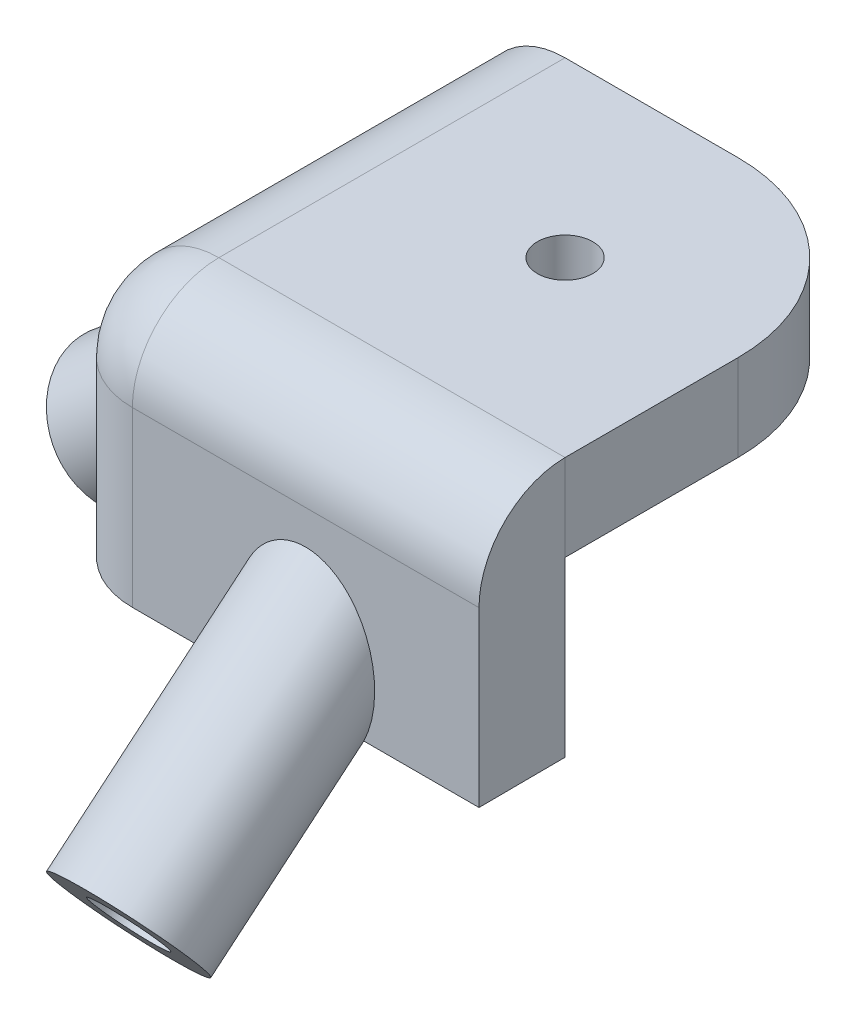
ISO-10303-21;
HEADER;
FILE_DESCRIPTION(('STEP AP214'),'2;1');
FILE_NAME('part.step','',(''),(''),'','','');
FILE_SCHEMA(('AUTOMOTIVE_DESIGN { 1 0 10303 214 1 1 1 1 }'));
ENDSEC;
DATA;
#1=APPLICATION_CONTEXT('core data for automotive mechanical design processes');
#2=APPLICATION_PROTOCOL_DEFINITION('international standard','automotive_design',2000,#1);
#3=PRODUCT_CONTEXT('',#1,'mechanical');
#4=PRODUCT('Part','Part','',(#3));
#5=PRODUCT_RELATED_PRODUCT_CATEGORY('part','',(#4));
#6=PRODUCT_DEFINITION_FORMATION('','',#4);
#7=PRODUCT_DEFINITION_CONTEXT('part definition',#1,'design');
#8=PRODUCT_DEFINITION('design','',#6,#7);
#9=PRODUCT_DEFINITION_SHAPE('','',#8);
#10=(LENGTH_UNIT() NAMED_UNIT(*) SI_UNIT(.MILLI.,.METRE.));
#11=(NAMED_UNIT(*) PLANE_ANGLE_UNIT() SI_UNIT($,.RADIAN.));
#12=(NAMED_UNIT(*) SI_UNIT($,.STERADIAN.) SOLID_ANGLE_UNIT());
#13=UNCERTAINTY_MEASURE_WITH_UNIT(LENGTH_MEASURE(1.E-05),#10,'distance_accuracy_value','');
#14=(GEOMETRIC_REPRESENTATION_CONTEXT(3) GLOBAL_UNCERTAINTY_ASSIGNED_CONTEXT((#13)) GLOBAL_UNIT_ASSIGNED_CONTEXT((#10,
#11,#12)) REPRESENTATION_CONTEXT('',''));
#15=CARTESIAN_POINT('',(0.,0.,0.));
#16=DIRECTION('',(0.,0.,1.));
#17=DIRECTION('',(1.,0.,0.));
#18=AXIS2_PLACEMENT_3D('',#15,#16,#17);
#19=CARTESIAN_POINT('',(10.,8.,10.));
#20=DIRECTION('',(-1.,0.,0.));
#21=DIRECTION('',(0.,0.,1.));
#22=AXIS2_PLACEMENT_3D('',#19,#20,#21);
#23=PLANE('',#22);
#24=DIRECTION('',(0.,0.,1.));
#25=VECTOR('',#24,1.);
#26=CARTESIAN_POINT('',(10.,3.,0.));
#27=LINE('',#26,#25);
#28=CARTESIAN_POINT('',(10.,3.,0.));
#29=VERTEX_POINT('',#28);
#30=CARTESIAN_POINT('',(10.,3.,10.));
#31=VERTEX_POINT('',#30);
#32=EDGE_CURVE('E134',#29,#31,#27,.T.);
#33=ORIENTED_EDGE('',*,*,#32,.F.);
#34=DIRECTION('',(0.,1.,0.));
#35=VECTOR('',#34,1.);
#36=CARTESIAN_POINT('',(10.,-15.8284607253071,0.));
#37=LINE('',#36,#35);
#38=CARTESIAN_POINT('',(10.,8.,0.));
#39=VERTEX_POINT('',#38);
#40=EDGE_CURVE('E147',#29,#39,#37,.T.);
#41=ORIENTED_EDGE('',*,*,#40,.T.);
#42=DIRECTION('',(0.,0.,-1.));
#43=VECTOR('',#42,1.);
#44=CARTESIAN_POINT('',(10.,8.,10.));
#45=LINE('',#44,#43);
#46=CARTESIAN_POINT('',(10.,8.,10.));
#47=VERTEX_POINT('',#46);
#48=EDGE_CURVE('E172',#47,#39,#45,.T.);
#49=ORIENTED_EDGE('',*,*,#48,.F.);
#50=DIRECTION('',(0.,-1.,0.));
#51=VECTOR('',#50,1.);
#52=CARTESIAN_POINT('',(10.,8.,10.));
#53=LINE('',#52,#51);
#54=EDGE_CURVE('E150',#47,#31,#53,.T.);
#55=ORIENTED_EDGE('',*,*,#54,.T.);
#56=EDGE_LOOP('',(#33,#41,#49,#55));
#57=FACE_BOUND('',#56,.T.);
#58=ADVANCED_FACE('F37',(#57),#23,.F.);
#59=CARTESIAN_POINT('',(0.,-15.8284607253071,0.));
#60=DIRECTION('',(0.,1.,0.));
#61=DIRECTION('',(0.,0.,1.));
#62=AXIS2_PLACEMENT_3D('',#59,#60,#61);
#63=CYLINDRICAL_SURFACE('',#62,1.6);
#64=CARTESIAN_POINT('',(0.,8.,0.));
#65=DIRECTION('',(0.,1.,0.));
#66=DIRECTION('',(0.,0.,1.));
#67=AXIS2_PLACEMENT_3D('',#64,#65,#66);
#68=CIRCLE('',#67,1.6);
#69=CARTESIAN_POINT('',(0.,8.,1.6));
#70=VERTEX_POINT('',#69);
#71=EDGE_CURVE('E159',#70,#70,#68,.T.);
#72=ORIENTED_EDGE('',*,*,#71,.T.);
#73=EDGE_LOOP('',(#72));
#74=FACE_BOUND('',#73,.T.);
#75=CARTESIAN_POINT('',(0.,3.,0.));
#76=DIRECTION('',(0.,-1.,0.));
#77=DIRECTION('',(0.,0.,-1.));
#78=AXIS2_PLACEMENT_3D('',#75,#76,#77);
#79=CIRCLE('',#78,1.6);
#80=CARTESIAN_POINT('',(0.,3.,-1.6));
#81=VERTEX_POINT('',#80);
#82=EDGE_CURVE('E227',#81,#81,#79,.F.);
#83=ORIENTED_EDGE('',*,*,#82,.F.);
#84=EDGE_LOOP('',(#83));
#85=FACE_BOUND('',#84,.T.);
#86=ADVANCED_FACE('F311',(#74,#85),#63,.F.);
#87=CARTESIAN_POINT('',(0.,-15.8284607253071,0.));
#88=DIRECTION('',(0.,1.,0.));
#89=DIRECTION('',(0.,0.,1.));
#90=AXIS2_PLACEMENT_3D('',#87,#88,#89);
#91=CYLINDRICAL_SURFACE('',#90,10.);
#92=CARTESIAN_POINT('',(0.,3.,0.));
#93=DIRECTION('',(0.,-1.,0.));
#94=DIRECTION('',(0.,0.,-1.));
#95=AXIS2_PLACEMENT_3D('',#92,#93,#94);
#96=CIRCLE('',#95,10.);
#97=CARTESIAN_POINT('',(0.,3.,-10.));
#98=VERTEX_POINT('',#97);
#99=EDGE_CURVE('E129',#98,#29,#96,.T.);
#100=ORIENTED_EDGE('',*,*,#99,.F.);
#101=DIRECTION('',(0.,1.,0.));
#102=VECTOR('',#101,1.);
#103=CARTESIAN_POINT('',(0.,-15.8284607253071,-10.));
#104=LINE('',#103,#102);
#105=CARTESIAN_POINT('',(0.,8.,-10.));
#106=VERTEX_POINT('',#105);
#107=EDGE_CURVE('E157',#98,#106,#104,.T.);
#108=ORIENTED_EDGE('',*,*,#107,.T.);
#109=CARTESIAN_POINT('',(0.,8.,0.));
#110=DIRECTION('',(0.,-1.,0.));
#111=DIRECTION('',(0.,0.,1.));
#112=AXIS2_PLACEMENT_3D('',#109,#110,#111);
#113=CIRCLE('',#112,10.);
#114=EDGE_CURVE('E155',#106,#39,#113,.T.);
#115=ORIENTED_EDGE('',*,*,#114,.T.);
#116=ORIENTED_EDGE('',*,*,#40,.F.);
#117=EDGE_LOOP('',(#100,#108,#115,#116));
#118=FACE_BOUND('',#117,.T.);
#119=ADVANCED_FACE('F153',(#118),#91,.T.);
#120=CARTESIAN_POINT('',(-10.,8.,-10.));
#121=DIRECTION('',(0.,0.,1.));
#122=DIRECTION('',(1.,0.,0.));
#123=AXIS2_PLACEMENT_3D('',#120,#121,#122);
#124=PLANE('',#123);
#125=DIRECTION('',(0.,1.,0.));
#126=VECTOR('',#125,1.);
#127=CARTESIAN_POINT('',(-15.,-7.,-10.));
#128=LINE('',#127,#126);
#129=CARTESIAN_POINT('',(-15.,-7.,-10.));
#130=VERTEX_POINT('',#129);
#131=CARTESIAN_POINT('',(-15.,3.,-10.));
#132=VERTEX_POINT('',#131);
#133=EDGE_CURVE('E257',#130,#132,#128,.T.);
#134=ORIENTED_EDGE('',*,*,#133,.T.);
#135=CARTESIAN_POINT('',(-10.,3.,-10.));
#136=DIRECTION('',(0.,0.,1.));
#137=DIRECTION('',(1.,0.,0.));
#138=AXIS2_PLACEMENT_3D('',#135,#136,#137);
#139=CIRCLE('',#138,5.);
#140=CARTESIAN_POINT('',(-10.,8.,-10.));
#141=VERTEX_POINT('',#140);
#142=EDGE_CURVE('E46',#132,#141,#139,.F.);
#143=ORIENTED_EDGE('',*,*,#142,.T.);
#144=DIRECTION('',(-1.,0.,0.));
#145=VECTOR('',#144,1.);
#146=CARTESIAN_POINT('',(-10.,8.,-10.));
#147=LINE('',#146,#145);
#148=EDGE_CURVE('E174',#106,#141,#147,.T.);
#149=ORIENTED_EDGE('',*,*,#148,.F.);
#150=ORIENTED_EDGE('',*,*,#107,.F.);
#151=DIRECTION('',(1.,0.,0.));
#152=VECTOR('',#151,1.);
#153=CARTESIAN_POINT('',(-10.,3.,-10.));
#154=LINE('',#153,#152);
#155=CARTESIAN_POINT('',(-10.,3.,-10.));
#156=VERTEX_POINT('',#155);
#157=EDGE_CURVE('E138',#156,#98,#154,.T.);
#158=ORIENTED_EDGE('',*,*,#157,.F.);
#159=DIRECTION('',(0.,1.,0.));
#160=VECTOR('',#159,1.);
#161=CARTESIAN_POINT('',(-10.,-7.,-10.));
#162=LINE('',#161,#160);
#163=CARTESIAN_POINT('',(-10.,-7.,-10.));
#164=VERTEX_POINT('',#163);
#165=EDGE_CURVE('E249',#164,#156,#162,.T.);
#166=ORIENTED_EDGE('',*,*,#165,.F.);
#167=DIRECTION('',(-1.,0.,0.));
#168=VECTOR('',#167,1.);
#169=CARTESIAN_POINT('',(-10.,-7.,-10.));
#170=LINE('',#169,#168);
#171=EDGE_CURVE('E233',#164,#130,#170,.T.);
#172=ORIENTED_EDGE('',*,*,#171,.T.);
#173=EDGE_LOOP('',(#134,#143,#149,#150,#158,#166,#172));
#174=FACE_BOUND('',#173,.T.);
#175=ADVANCED_FACE('F287',(#174),#124,.F.);
#176=CARTESIAN_POINT('',(0.,8.,0.));
#177=DIRECTION('',(0.,-1.,0.));
#178=DIRECTION('',(0.,0.,-1.));
#179=AXIS2_PLACEMENT_3D('',#176,#177,#178);
#180=PLANE('',#179);
#181=ORIENTED_EDGE('',*,*,#71,.F.);
#182=EDGE_LOOP('',(#181));
#183=FACE_BOUND('',#182,.T.);
#184=DIRECTION('',(0.,0.,1.));
#185=VECTOR('',#184,1.);
#186=CARTESIAN_POINT('',(-9.99999999999999,8.,15.));
#187=LINE('',#186,#185);
#188=CARTESIAN_POINT('',(-9.99999999999999,8.,10.));
#189=VERTEX_POINT('',#188);
#190=EDGE_CURVE('E186',#141,#189,#187,.T.);
#191=ORIENTED_EDGE('',*,*,#190,.T.);
#192=DIRECTION('',(1.,0.,0.));
#193=VECTOR('',#192,1.);
#194=CARTESIAN_POINT('',(10.0285538915239,8.,10.));
#195=LINE('',#194,#193);
#196=EDGE_CURVE('E188',#189,#47,#195,.T.);
#197=ORIENTED_EDGE('',*,*,#196,.T.);
#198=ORIENTED_EDGE('',*,*,#48,.T.);
#199=ORIENTED_EDGE('',*,*,#114,.F.);
#200=ORIENTED_EDGE('',*,*,#148,.T.);
#201=EDGE_LOOP('',(#191,#197,#198,#199,#200));
#202=FACE_BOUND('',#201,.T.);
#203=ADVANCED_FACE('F321',(#183,#202),#180,.F.);
#204=CARTESIAN_POINT('',(10.,-7.,10.));
#205=DIRECTION('',(0.,0.,-1.));
#206=DIRECTION('',(-1.,0.,0.));
#207=AXIS2_PLACEMENT_3D('',#204,#205,#206);
#208=PLANE('',#207);
#209=DIRECTION('',(-1.,0.,0.));
#210=VECTOR('',#209,1.);
#211=CARTESIAN_POINT('',(10.,3.,10.));
#212=LINE('',#211,#210);
#213=CARTESIAN_POINT('',(-10.,3.,10.));
#214=VERTEX_POINT('',#213);
#215=EDGE_CURVE('E151',#31,#214,#212,.T.);
#216=ORIENTED_EDGE('',*,*,#215,.F.);
#217=DIRECTION('',(0.,1.,0.));
#218=VECTOR('',#217,1.);
#219=CARTESIAN_POINT('',(10.,-7.,10.));
#220=LINE('',#219,#218);
#221=CARTESIAN_POINT('',(10.,-7.,10.));
#222=VERTEX_POINT('',#221);
#223=EDGE_CURVE('E252',#222,#31,#220,.T.);
#224=ORIENTED_EDGE('',*,*,#223,.F.);
#225=DIRECTION('',(-1.,0.,0.));
#226=VECTOR('',#225,1.);
#227=CARTESIAN_POINT('',(10.,-7.,10.));
#228=LINE('',#227,#226);
#229=CARTESIAN_POINT('',(-10.,-7.,10.));
#230=VERTEX_POINT('',#229);
#231=EDGE_CURVE('E246',#222,#230,#228,.T.);
#232=ORIENTED_EDGE('',*,*,#231,.T.);
#233=DIRECTION('',(0.,1.,0.));
#234=VECTOR('',#233,1.);
#235=CARTESIAN_POINT('',(-10.,-7.,10.));
#236=LINE('',#235,#234);
#237=EDGE_CURVE('E250',#230,#214,#236,.T.);
#238=ORIENTED_EDGE('',*,*,#237,.T.);
#239=EDGE_LOOP('',(#216,#224,#232,#238));
#240=FACE_BOUND('',#239,.T.);
#241=ADVANCED_FACE('F293',(#240),#208,.T.);
#242=CARTESIAN_POINT('',(-10.,-7.,10.));
#243=DIRECTION('',(1.,0.,0.));
#244=DIRECTION('',(0.,0.,-1.));
#245=AXIS2_PLACEMENT_3D('',#242,#243,#244);
#246=PLANE('',#245);
#247=DIRECTION('',(0.,0.,-1.));
#248=VECTOR('',#247,1.);
#249=CARTESIAN_POINT('',(-10.,3.,10.));
#250=LINE('',#249,#248);
#251=EDGE_CURVE('E224',#214,#156,#250,.T.);
#252=ORIENTED_EDGE('',*,*,#251,.F.);
#253=ORIENTED_EDGE('',*,*,#237,.F.);
#254=DIRECTION('',(0.,0.,-1.));
#255=VECTOR('',#254,1.);
#256=CARTESIAN_POINT('',(-10.,-7.,10.));
#257=LINE('',#256,#255);
#258=EDGE_CURVE('E230',#230,#164,#257,.T.);
#259=ORIENTED_EDGE('',*,*,#258,.T.);
#260=ORIENTED_EDGE('',*,*,#165,.T.);
#261=EDGE_LOOP('',(#252,#253,#259,#260));
#262=FACE_BOUND('',#261,.T.);
#263=ADVANCED_FACE('F291',(#262),#246,.T.);
#264=CARTESIAN_POINT('',(10.0285538915239,-7.,15.));
#265=DIRECTION('',(0.999983693904419,0.,-0.00571068518427591));
#266=DIRECTION('',(-0.00571068518427591,0.,-0.999983693904419));
#267=AXIS2_PLACEMENT_3D('',#264,#265,#266);
#268=PLANE('',#267);
#269=ORIENTED_EDGE('',*,*,#54,.F.);
#270=CARTESIAN_POINT('',(10.,3.,10.));
#271=DIRECTION('',(0.999983693904419,0.,-0.00571068518427591));
#272=DIRECTION('',(-0.00571068518427591,0.,-0.999983693904419));
#273=AXIS2_PLACEMENT_3D('',#270,#271,#272);
#274=ELLIPSE('',#273,5.00008153180737,5.);
#275=CARTESIAN_POINT('',(10.0285538915239,3.,15.));
#276=VERTEX_POINT('',#275);
#277=EDGE_CURVE('E191',#47,#276,#274,.T.);
#278=ORIENTED_EDGE('',*,*,#277,.T.);
#279=DIRECTION('',(0.,1.,0.));
#280=VECTOR('',#279,1.);
#281=CARTESIAN_POINT('',(10.0285538915239,-7.,15.));
#282=LINE('',#281,#280);
#283=CARTESIAN_POINT('',(10.0285538915239,-7.,15.));
#284=VERTEX_POINT('',#283);
#285=EDGE_CURVE('E254',#284,#276,#282,.T.);
#286=ORIENTED_EDGE('',*,*,#285,.F.);
#287=DIRECTION('',(-0.00571068518427591,0.,-0.999983693904419));
#288=VECTOR('',#287,1.);
#289=CARTESIAN_POINT('',(10.0285538915239,-7.,15.));
#290=LINE('',#289,#288);
#291=EDGE_CURVE('E243',#284,#222,#290,.T.);
#292=ORIENTED_EDGE('',*,*,#291,.T.);
#293=ORIENTED_EDGE('',*,*,#223,.T.);
#294=EDGE_LOOP('',(#269,#278,#286,#292,#293));
#295=FACE_BOUND('',#294,.T.);
#296=ADVANCED_FACE('F296',(#295),#268,.T.);
#297=CARTESIAN_POINT('',(-15.,-7.,15.));
#298=DIRECTION('',(0.,0.,1.));
#299=DIRECTION('',(1.,0.,0.));
#300=AXIS2_PLACEMENT_3D('',#297,#298,#299);
#301=PLANE('',#300);
#302=ORIENTED_EDGE('',*,*,#285,.T.);
#303=DIRECTION('',(1.,0.,0.));
#304=VECTOR('',#303,1.);
#305=CARTESIAN_POINT('',(-15.,3.,15.));
#306=LINE('',#305,#304);
#307=CARTESIAN_POINT('',(-9.99999999999999,3.,15.));
#308=VERTEX_POINT('',#307);
#309=EDGE_CURVE('E195',#276,#308,#306,.F.);
#310=ORIENTED_EDGE('',*,*,#309,.T.);
#311=DIRECTION('',(0.,1.,0.));
#312=VECTOR('',#311,1.);
#313=CARTESIAN_POINT('',(-9.99999999999999,-7.,15.));
#314=LINE('',#313,#312);
#315=CARTESIAN_POINT('',(-10.,-7.,15.));
#316=VERTEX_POINT('',#315);
#317=EDGE_CURVE('E193',#308,#316,#314,.F.);
#318=ORIENTED_EDGE('',*,*,#317,.T.);
#319=DIRECTION('',(1.,0.,0.));
#320=VECTOR('',#319,1.);
#321=CARTESIAN_POINT('',(-15.,-7.,15.));
#322=LINE('',#321,#320);
#323=CARTESIAN_POINT('',(-3.37409146636902,-7.,15.));
#324=VERTEX_POINT('',#323);
#325=EDGE_CURVE('E241',#316,#324,#322,.T.);
#326=ORIENTED_EDGE('',*,*,#325,.T.);
#327=CARTESIAN_POINT('',(0.,-4.19549815588642,15.));
#328=DIRECTION('',(0.,0.,1.));
#329=DIRECTION('',(0.,1.,0.));
#330=AXIS2_PLACEMENT_3D('',#327,#328,#329);
#331=ELLIPSE('',#330,5.22162915732912,4.);
#332=CARTESIAN_POINT('',(3.37409146636901,-7.,15.));
#333=VERTEX_POINT('',#332);
#334=EDGE_CURVE('E183',#333,#324,#331,.T.);
#335=ORIENTED_EDGE('',*,*,#334,.F.);
#336=EDGE_CURVE('E240',#333,#284,#322,.T.);
#337=ORIENTED_EDGE('',*,*,#336,.T.);
#338=EDGE_LOOP('',(#302,#310,#318,#326,#335,#337));
#339=FACE_BOUND('',#338,.T.);
#340=ADVANCED_FACE('F272',(#339),#301,.T.);
#341=CARTESIAN_POINT('',(-15.,-7.,-10.));
#342=DIRECTION('',(-1.,0.,0.));
#343=DIRECTION('',(0.,0.,1.));
#344=AXIS2_PLACEMENT_3D('',#341,#342,#343);
#345=PLANE('',#344);
#346=DIRECTION('',(0.,1.,0.));
#347=VECTOR('',#346,1.);
#348=CARTESIAN_POINT('',(-15.,-7.,10.));
#349=LINE('',#348,#347);
#350=CARTESIAN_POINT('',(-15.,-7.,10.));
#351=VERTEX_POINT('',#350);
#352=CARTESIAN_POINT('',(-15.,3.,10.));
#353=VERTEX_POINT('',#352);
#354=EDGE_CURVE('E54',#351,#353,#349,.T.);
#355=ORIENTED_EDGE('',*,*,#354,.T.);
#356=DIRECTION('',(0.,0.,1.));
#357=VECTOR('',#356,1.);
#358=CARTESIAN_POINT('',(-15.,3.,-10.));
#359=LINE('',#358,#357);
#360=EDGE_CURVE('E58',#353,#132,#359,.F.);
#361=ORIENTED_EDGE('',*,*,#360,.T.);
#362=ORIENTED_EDGE('',*,*,#133,.F.);
#363=DIRECTION('',(0.,0.,1.));
#364=VECTOR('',#363,1.);
#365=CARTESIAN_POINT('',(-15.,-7.,-10.));
#366=LINE('',#365,#364);
#367=CARTESIAN_POINT('',(-15.,-7.,-3.37409146636901));
#368=VERTEX_POINT('',#367);
#369=EDGE_CURVE('E237',#130,#368,#366,.T.);
#370=ORIENTED_EDGE('',*,*,#369,.T.);
#371=CARTESIAN_POINT('',(-15.,-4.19549815588641,0.));
#372=DIRECTION('',(-1.,0.,0.));
#373=DIRECTION('',(0.,1.,0.));
#374=AXIS2_PLACEMENT_3D('',#371,#372,#373);
#375=ELLIPSE('',#374,5.22162915732912,4.);
#376=CARTESIAN_POINT('',(-15.,-7.,3.37409146636901));
#377=VERTEX_POINT('',#376);
#378=EDGE_CURVE('E181',#377,#368,#375,.T.);
#379=ORIENTED_EDGE('',*,*,#378,.F.);
#380=EDGE_CURVE('E236',#377,#351,#366,.T.);
#381=ORIENTED_EDGE('',*,*,#380,.T.);
#382=EDGE_LOOP('',(#355,#361,#362,#370,#379,#381));
#383=FACE_BOUND('',#382,.T.);
#384=ADVANCED_FACE('F279',(#383),#345,.T.);
#385=CARTESIAN_POINT('',(0.,-7.,0.));
#386=DIRECTION('',(0.,1.,0.));
#387=DIRECTION('',(0.,0.,1.));
#388=AXIS2_PLACEMENT_3D('',#385,#386,#387);
#389=PLANE('',#388);
#390=ORIENTED_EDGE('',*,*,#325,.F.);
#391=CARTESIAN_POINT('',(-9.99999999999999,-7.,10.));
#392=DIRECTION('',(0.,1.,0.));
#393=DIRECTION('',(0.,0.,1.));
#394=AXIS2_PLACEMENT_3D('',#391,#392,#393);
#395=CIRCLE('',#394,5.);
#396=EDGE_CURVE('E11',#316,#351,#395,.F.);
#397=ORIENTED_EDGE('',*,*,#396,.T.);
#398=ORIENTED_EDGE('',*,*,#380,.F.);
#399=CARTESIAN_POINT('',(-18.3422751481594,-7.,0.));
#400=DIRECTION('',(0.,1.,0.));
#401=DIRECTION('',(1.,0.,0.));
#402=AXIS2_PLACEMENT_3D('',#399,#400,#401);
#403=ELLIPSE('',#402,6.22289530744164,4.);
#404=EDGE_CURVE('E178',#377,#368,#403,.T.);
#405=ORIENTED_EDGE('',*,*,#404,.T.);
#406=ORIENTED_EDGE('',*,*,#369,.F.);
#407=ORIENTED_EDGE('',*,*,#171,.F.);
#408=ORIENTED_EDGE('',*,*,#258,.F.);
#409=ORIENTED_EDGE('',*,*,#231,.F.);
#410=ORIENTED_EDGE('',*,*,#291,.F.);
#411=ORIENTED_EDGE('',*,*,#336,.F.);
#412=CARTESIAN_POINT('',(0.,-7.,18.3422751481594));
#413=DIRECTION('',(0.,1.,0.));
#414=DIRECTION('',(0.,0.,-1.));
#415=AXIS2_PLACEMENT_3D('',#412,#413,#414);
#416=ELLIPSE('',#415,6.22289530744164,4.);
#417=EDGE_CURVE('E161',#333,#324,#416,.T.);
#418=ORIENTED_EDGE('',*,*,#417,.T.);
#419=EDGE_LOOP('',(#390,#397,#398,#405,#406,#407,#408,#409,#410,#411,#418));
#420=FACE_BOUND('',#419,.T.);
#421=ADVANCED_FACE('F264',(#420),#389,.F.);
#422=CARTESIAN_POINT('',(-25.2118800659256,-12.7642829528312,0.));
#423=DIRECTION('',(-0.766044443118977,-0.642787609686541,0.));
#424=DIRECTION('',(0.64278760968654,-0.766044443118977,0.));
#425=AXIS2_PLACEMENT_3D('',#422,#423,#424);
#426=PLANE('',#425);
#427=CARTESIAN_POINT('',(-25.2118800659256,-12.7642829528312,0.));
#428=DIRECTION('',(-0.766044443118977,-0.64278760968654,0.));
#429=DIRECTION('',(0.64278760968654,-0.766044443118977,0.));
#430=AXIS2_PLACEMENT_3D('',#427,#428,#429);
#431=CIRCLE('',#430,2.05);
#432=CARTESIAN_POINT('',(-23.8941654660682,-14.3346740612251,0.));
#433=VERTEX_POINT('',#432);
#434=EDGE_CURVE('E216',#433,#433,#431,.T.);
#435=ORIENTED_EDGE('',*,*,#434,.F.);
#436=EDGE_LOOP('',(#435));
#437=FACE_BOUND('',#436,.T.);
#438=CARTESIAN_POINT('',(-25.2118800659256,-12.7642829528312,0.));
#439=DIRECTION('',(-0.766044443118977,-0.642787609686541,0.));
#440=DIRECTION('',(0.64278760968654,-0.766044443118977,0.));
#441=AXIS2_PLACEMENT_3D('',#438,#439,#440);
#442=CIRCLE('',#441,4.);
#443=CARTESIAN_POINT('',(-22.6407296271794,-15.8284607253071,0.));
#444=VERTEX_POINT('',#443);
#445=EDGE_CURVE('E166',#444,#444,#442,.T.);
#446=ORIENTED_EDGE('',*,*,#445,.T.);
#447=EDGE_LOOP('',(#446));
#448=FACE_BOUND('',#447,.T.);
#449=ADVANCED_FACE('F333',(#437,#448),#426,.T.);
#450=CARTESIAN_POINT('',(-25.2118800659256,-12.7642829528312,0.));
#451=DIRECTION('',(0.766044443118977,0.64278760968654,0.));
#452=DIRECTION('',(-0.64278760968654,0.766044443118977,0.));
#453=AXIS2_PLACEMENT_3D('',#450,#451,#452);
#454=CYLINDRICAL_SURFACE('',#453,4.);
#455=ORIENTED_EDGE('',*,*,#404,.F.);
#456=ORIENTED_EDGE('',*,*,#378,.T.);
#457=EDGE_LOOP('',(#455,#456));
#458=FACE_BOUND('',#457,.T.);
#459=ORIENTED_EDGE('',*,*,#445,.F.);
#460=EDGE_LOOP('',(#459));
#461=FACE_BOUND('',#460,.T.);
#462=ADVANCED_FACE('F282',(#458,#461),#454,.T.);
#463=CARTESIAN_POINT('',(0.,-12.7642829528312,25.2118800659256));
#464=DIRECTION('',(0.,-0.642787609686541,0.766044443118977));
#465=DIRECTION('',(0.,-0.766044443118977,-0.64278760968654));
#466=AXIS2_PLACEMENT_3D('',#463,#464,#465);
#467=PLANE('',#466);
#468=CARTESIAN_POINT('',(0.,-12.7642829528312,25.2118800659256));
#469=DIRECTION('',(0.,-0.64278760968654,0.766044443118977));
#470=DIRECTION('',(0.,-0.766044443118977,-0.64278760968654));
#471=AXIS2_PLACEMENT_3D('',#468,#469,#470);
#472=CIRCLE('',#471,2.05);
#473=CARTESIAN_POINT('',(0.,-14.3346740612251,23.8941654660682));
#474=VERTEX_POINT('',#473);
#475=EDGE_CURVE('E208',#474,#474,#472,.T.);
#476=ORIENTED_EDGE('',*,*,#475,.F.);
#477=EDGE_LOOP('',(#476));
#478=FACE_BOUND('',#477,.T.);
#479=CARTESIAN_POINT('',(0.,-12.7642829528312,25.2118800659256));
#480=DIRECTION('',(0.,-0.642787609686541,0.766044443118977));
#481=DIRECTION('',(0.,-0.766044443118977,-0.64278760968654));
#482=AXIS2_PLACEMENT_3D('',#479,#480,#481);
#483=CIRCLE('',#482,4.);
#484=CARTESIAN_POINT('',(0.,-15.8284607253071,22.6407296271794));
#485=VERTEX_POINT('',#484);
#486=EDGE_CURVE('E169',#485,#485,#483,.T.);
#487=ORIENTED_EDGE('',*,*,#486,.T.);
#488=EDGE_LOOP('',(#487));
#489=FACE_BOUND('',#488,.T.);
#490=ADVANCED_FACE('F327',(#478,#489),#467,.T.);
#491=CARTESIAN_POINT('',(0.,-12.7642829528312,25.2118800659256));
#492=DIRECTION('',(0.,0.64278760968654,-0.766044443118977));
#493=DIRECTION('',(0.,0.766044443118977,0.64278760968654));
#494=AXIS2_PLACEMENT_3D('',#491,#492,#493);
#495=CYLINDRICAL_SURFACE('',#494,4.);
#496=ORIENTED_EDGE('',*,*,#417,.F.);
#497=ORIENTED_EDGE('',*,*,#334,.T.);
#498=EDGE_LOOP('',(#496,#497));
#499=FACE_BOUND('',#498,.T.);
#500=ORIENTED_EDGE('',*,*,#486,.F.);
#501=EDGE_LOOP('',(#500));
#502=FACE_BOUND('',#501,.T.);
#503=ADVANCED_FACE('F269',(#499,#502),#495,.T.);
#504=CARTESIAN_POINT('',(0.,3.,0.));
#505=DIRECTION('',(0.,-1.,0.));
#506=DIRECTION('',(0.,0.,-1.));
#507=AXIS2_PLACEMENT_3D('',#504,#505,#506);
#508=PLANE('',#507);
#509=ORIENTED_EDGE('',*,*,#99,.T.);
#510=ORIENTED_EDGE('',*,*,#32,.T.);
#511=ORIENTED_EDGE('',*,*,#215,.T.);
#512=ORIENTED_EDGE('',*,*,#251,.T.);
#513=ORIENTED_EDGE('',*,*,#157,.T.);
#514=EDGE_LOOP('',(#509,#510,#511,#512,#513));
#515=FACE_BOUND('',#514,.T.);
#516=ORIENTED_EDGE('',*,*,#82,.T.);
#517=EDGE_LOOP('',(#516));
#518=FACE_BOUND('',#517,.T.);
#519=ADVANCED_FACE('F131',(#515,#518),#508,.T.);
#520=CARTESIAN_POINT('',(-17.5514356347358,-6.33640685596582,0.));
#521=DIRECTION('',(-0.766044443118977,-0.64278760968654,0.));
#522=DIRECTION('',(0.64278760968654,-0.766044443118977,0.));
#523=AXIS2_PLACEMENT_3D('',#520,#521,#522);
#524=CYLINDRICAL_SURFACE('',#523,2.05);
#525=CARTESIAN_POINT('',(-17.5514356347358,-6.33640685596582,0.));
#526=DIRECTION('',(-0.766044443118977,-0.64278760968654,0.));
#527=DIRECTION('',(0.64278760968654,-0.766044443118977,0.));
#528=AXIS2_PLACEMENT_3D('',#525,#526,#527);
#529=CIRCLE('',#528,2.05);
#530=CARTESIAN_POINT('',(-16.2337210348784,-7.90679796435973,0.));
#531=VERTEX_POINT('',#530);
#532=EDGE_CURVE('E142',#531,#531,#529,.T.);
#533=ORIENTED_EDGE('',*,*,#532,.F.);
#534=EDGE_LOOP('',(#533));
#535=FACE_BOUND('',#534,.T.);
#536=ORIENTED_EDGE('',*,*,#434,.T.);
#537=EDGE_LOOP('',(#536));
#538=FACE_BOUND('',#537,.T.);
#539=ADVANCED_FACE('F353',(#535,#538),#524,.F.);
#540=CARTESIAN_POINT('',(-17.5514356347358,-6.33640685596582,0.));
#541=DIRECTION('',(-0.766044443118977,-0.64278760968654,0.));
#542=DIRECTION('',(0.64278760968654,-0.766044443118977,0.));
#543=AXIS2_PLACEMENT_3D('',#540,#541,#542);
#544=PLANE('',#543);
#545=ORIENTED_EDGE('',*,*,#532,.T.);
#546=EDGE_LOOP('',(#545));
#547=FACE_BOUND('',#546,.T.);
#548=ADVANCED_FACE('F356',(#547),#544,.T.);
#549=CARTESIAN_POINT('',(0.,-6.33640685596582,17.5514356347358));
#550=DIRECTION('',(0.,-0.64278760968654,0.766044443118977));
#551=DIRECTION('',(0.,-0.766044443118977,-0.64278760968654));
#552=AXIS2_PLACEMENT_3D('',#549,#550,#551);
#553=CYLINDRICAL_SURFACE('',#552,2.05);
#554=CARTESIAN_POINT('',(0.,-6.33640685596582,17.5514356347358));
#555=DIRECTION('',(0.,-0.64278760968654,0.766044443118977));
#556=DIRECTION('',(0.,-0.766044443118977,-0.64278760968654));
#557=AXIS2_PLACEMENT_3D('',#554,#555,#556);
#558=CIRCLE('',#557,2.05);
#559=CARTESIAN_POINT('',(0.,-7.90679796435972,16.2337210348784));
#560=VERTEX_POINT('',#559);
#561=EDGE_CURVE('E211',#560,#560,#558,.T.);
#562=ORIENTED_EDGE('',*,*,#561,.F.);
#563=EDGE_LOOP('',(#562));
#564=FACE_BOUND('',#563,.T.);
#565=ORIENTED_EDGE('',*,*,#475,.T.);
#566=EDGE_LOOP('',(#565));
#567=FACE_BOUND('',#566,.T.);
#568=ADVANCED_FACE('F360',(#564,#567),#553,.F.);
#569=CARTESIAN_POINT('',(0.,-6.33640685596582,17.5514356347358));
#570=DIRECTION('',(0.,-0.64278760968654,0.766044443118977));
#571=DIRECTION('',(0.,-0.766044443118977,-0.64278760968654));
#572=AXIS2_PLACEMENT_3D('',#569,#570,#571);
#573=PLANE('',#572);
#574=ORIENTED_EDGE('',*,*,#561,.T.);
#575=EDGE_LOOP('',(#574));
#576=FACE_BOUND('',#575,.T.);
#577=ADVANCED_FACE('F364',(#576),#573,.T.);
#578=CARTESIAN_POINT('',(-9.99999999999999,-7.,10.));
#579=DIRECTION('',(0.,1.,0.));
#580=DIRECTION('',(0.,0.,1.));
#581=AXIS2_PLACEMENT_3D('',#578,#579,#580);
#582=CYLINDRICAL_SURFACE('',#581,5.);
#583=ORIENTED_EDGE('',*,*,#396,.F.);
#584=ORIENTED_EDGE('',*,*,#317,.F.);
#585=CARTESIAN_POINT('',(-9.99999999999999,3.,10.));
#586=DIRECTION('',(0.,1.,0.));
#587=DIRECTION('',(0.,0.,1.));
#588=AXIS2_PLACEMENT_3D('',#585,#586,#587);
#589=CIRCLE('',#588,5.);
#590=EDGE_CURVE('E41',#353,#308,#589,.T.);
#591=ORIENTED_EDGE('',*,*,#590,.F.);
#592=ORIENTED_EDGE('',*,*,#354,.F.);
#593=EDGE_LOOP('',(#583,#584,#591,#592));
#594=FACE_BOUND('',#593,.T.);
#595=ADVANCED_FACE('F39',(#594),#582,.T.);
#596=CARTESIAN_POINT('',(-10.,3.,0.));
#597=DIRECTION('',(0.,0.,-1.));
#598=DIRECTION('',(-1.,0.,0.));
#599=AXIS2_PLACEMENT_3D('',#596,#597,#598);
#600=CYLINDRICAL_SURFACE('',#599,5.);
#601=ORIENTED_EDGE('',*,*,#142,.F.);
#602=ORIENTED_EDGE('',*,*,#360,.F.);
#603=CARTESIAN_POINT('',(-9.99999999999999,3.,10.));
#604=DIRECTION('',(0.,0.,1.));
#605=DIRECTION('',(1.,0.,0.));
#606=AXIS2_PLACEMENT_3D('',#603,#604,#605);
#607=CIRCLE('',#606,5.);
#608=EDGE_CURVE('E202',#189,#353,#607,.T.);
#609=ORIENTED_EDGE('',*,*,#608,.F.);
#610=ORIENTED_EDGE('',*,*,#190,.F.);
#611=EDGE_LOOP('',(#601,#602,#609,#610));
#612=FACE_BOUND('',#611,.T.);
#613=ADVANCED_FACE('F302',(#612),#600,.T.);
#614=CARTESIAN_POINT('',(-9.99999999999999,3.,10.));
#615=DIRECTION('',(0.,0.,1.));
#616=DIRECTION('',(1.,0.,0.));
#617=AXIS2_PLACEMENT_3D('',#614,#615,#616);
#618=SPHERICAL_SURFACE('',#617,5.);
#619=ORIENTED_EDGE('',*,*,#608,.T.);
#620=ORIENTED_EDGE('',*,*,#590,.T.);
#621=CARTESIAN_POINT('',(-9.99999999999999,3.,10.));
#622=DIRECTION('',(-1.,0.,0.));
#623=DIRECTION('',(0.,0.,1.));
#624=AXIS2_PLACEMENT_3D('',#621,#622,#623);
#625=CIRCLE('',#624,5.);
#626=EDGE_CURVE('E200',#189,#308,#625,.F.);
#627=ORIENTED_EDGE('',*,*,#626,.F.);
#628=EDGE_LOOP('',(#619,#620,#627));
#629=FACE_BOUND('',#628,.T.);
#630=ADVANCED_FACE('F300',(#629),#618,.T.);
#631=CARTESIAN_POINT('',(0.,3.,10.));
#632=DIRECTION('',(-1.,0.,0.));
#633=DIRECTION('',(0.,0.,1.));
#634=AXIS2_PLACEMENT_3D('',#631,#632,#633);
#635=CYLINDRICAL_SURFACE('',#634,5.);
#636=ORIENTED_EDGE('',*,*,#626,.T.);
#637=ORIENTED_EDGE('',*,*,#309,.F.);
#638=ORIENTED_EDGE('',*,*,#277,.F.);
#639=ORIENTED_EDGE('',*,*,#196,.F.);
#640=EDGE_LOOP('',(#636,#637,#638,#639));
#641=FACE_BOUND('',#640,.T.);
#642=ADVANCED_FACE('F298',(#641),#635,.T.);
#643=CLOSED_SHELL('',(#58,#86,#119,#175,#203,#241,#263,#296,#340,#384,#421,#449,#462,#490,#503,
#519,#539,#548,#568,#577,#595,#613,#630,#642));
#644=MANIFOLD_SOLID_BREP('B2',#643);
#645=ADVANCED_BREP_SHAPE_REPRESENTATION('',(#18,#644),#14);
#646=SHAPE_DEFINITION_REPRESENTATION(#9,#645);
ENDSEC;
END-ISO-10303-21;
